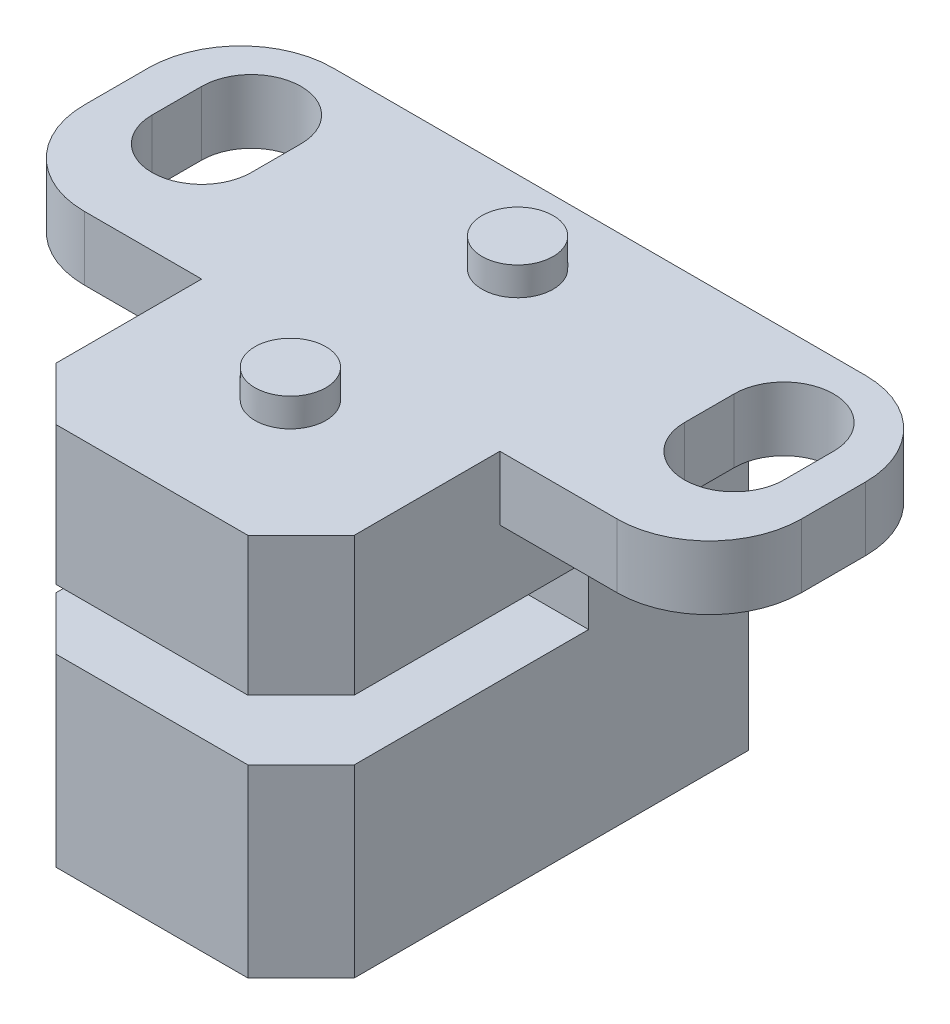
ISO-10303-21;
HEADER;
FILE_DESCRIPTION(('STEP AP214'),'2;1');
FILE_NAME('part.step','',(''),(''),'','','');
FILE_SCHEMA(('AUTOMOTIVE_DESIGN { 1 0 10303 214 1 1 1 1 }'));
ENDSEC;
DATA;
#1=APPLICATION_CONTEXT('core data for automotive mechanical design processes');
#2=APPLICATION_PROTOCOL_DEFINITION('international standard','automotive_design',2000,#1);
#3=PRODUCT_CONTEXT('',#1,'mechanical');
#4=PRODUCT('Part','Part','',(#3));
#5=PRODUCT_RELATED_PRODUCT_CATEGORY('part','',(#4));
#6=PRODUCT_DEFINITION_FORMATION('','',#4);
#7=PRODUCT_DEFINITION_CONTEXT('part definition',#1,'design');
#8=PRODUCT_DEFINITION('design','',#6,#7);
#9=PRODUCT_DEFINITION_SHAPE('','',#8);
#10=(LENGTH_UNIT() NAMED_UNIT(*) SI_UNIT(.MILLI.,.METRE.));
#11=(NAMED_UNIT(*) PLANE_ANGLE_UNIT() SI_UNIT($,.RADIAN.));
#12=(NAMED_UNIT(*) SI_UNIT($,.STERADIAN.) SOLID_ANGLE_UNIT());
#13=UNCERTAINTY_MEASURE_WITH_UNIT(LENGTH_MEASURE(1.E-05),#10,'distance_accuracy_value','');
#14=(GEOMETRIC_REPRESENTATION_CONTEXT(3) GLOBAL_UNCERTAINTY_ASSIGNED_CONTEXT((#13)) GLOBAL_UNIT_ASSIGNED_CONTEXT((#10,
#11,#12)) REPRESENTATION_CONTEXT('',''));
#15=CARTESIAN_POINT('',(0.,0.,0.));
#16=DIRECTION('',(0.,0.,1.));
#17=DIRECTION('',(1.,0.,0.));
#18=AXIS2_PLACEMENT_3D('',#15,#16,#17);
#19=CARTESIAN_POINT('',(-4.2,10.8,4.8));
#20=DIRECTION('',(0.707106781186547,0.,-0.707106781186547));
#21=DIRECTION('',(-0.707106781186548,0.,-0.707106781186547));
#22=AXIS2_PLACEMENT_3D('',#19,#20,#21);
#23=PLANE('',#22);
#24=DIRECTION('',(0.,-1.,0.));
#25=VECTOR('',#24,1.);
#26=CARTESIAN_POINT('',(-4.2,10.8,4.8));
#27=LINE('',#26,#25);
#28=CARTESIAN_POINT('',(-4.2,10.8,4.8));
#29=VERTEX_POINT('',#28);
#30=CARTESIAN_POINT('',(-4.2,6.9,4.8));
#31=VERTEX_POINT('',#30);
#32=EDGE_CURVE('E448',#29,#31,#27,.T.);
#33=ORIENTED_EDGE('',*,*,#32,.T.);
#34=DIRECTION('',(0.707106781186548,0.,0.707106781186547));
#35=VECTOR('',#34,1.);
#36=CARTESIAN_POINT('',(-4.2,6.9,4.8));
#37=LINE('',#36,#35);
#38=CARTESIAN_POINT('',(-2.7,6.9,6.3));
#39=VERTEX_POINT('',#38);
#40=EDGE_CURVE('E258',#31,#39,#37,.T.);
#41=ORIENTED_EDGE('',*,*,#40,.T.);
#42=DIRECTION('',(0.,-1.,0.));
#43=VECTOR('',#42,1.);
#44=CARTESIAN_POINT('',(-2.7,10.8,6.3));
#45=LINE('',#44,#43);
#46=CARTESIAN_POINT('',(-2.7,10.8,6.3));
#47=VERTEX_POINT('',#46);
#48=EDGE_CURVE('E445',#47,#39,#45,.T.);
#49=ORIENTED_EDGE('',*,*,#48,.F.);
#50=DIRECTION('',(0.707106781186548,0.,0.707106781186547));
#51=VECTOR('',#50,1.);
#52=CARTESIAN_POINT('',(-4.2,10.8,4.8));
#53=LINE('',#52,#51);
#54=EDGE_CURVE('E415',#29,#47,#53,.T.);
#55=ORIENTED_EDGE('',*,*,#54,.F.);
#56=EDGE_LOOP('',(#33,#41,#49,#55));
#57=FACE_BOUND('',#56,.T.);
#58=ADVANCED_FACE('F34',(#57),#23,.F.);
#59=CARTESIAN_POINT('',(-2.7,10.8,6.3));
#60=DIRECTION('',(0.,0.,-1.));
#61=DIRECTION('',(-1.,0.,0.));
#62=AXIS2_PLACEMENT_3D('',#59,#60,#61);
#63=PLANE('',#62);
#64=ORIENTED_EDGE('',*,*,#48,.T.);
#65=DIRECTION('',(1.,0.,0.));
#66=VECTOR('',#65,1.);
#67=CARTESIAN_POINT('',(-10.1,6.9,6.3));
#68=LINE('',#67,#66);
#69=CARTESIAN_POINT('',(2.70000000000001,6.9,6.3));
#70=VERTEX_POINT('',#69);
#71=EDGE_CURVE('E532',#39,#70,#68,.T.);
#72=ORIENTED_EDGE('',*,*,#71,.T.);
#73=DIRECTION('',(0.,-1.,0.));
#74=VECTOR('',#73,1.);
#75=CARTESIAN_POINT('',(2.7,10.8,6.3));
#76=LINE('',#75,#74);
#77=CARTESIAN_POINT('',(2.7,10.8,6.3));
#78=VERTEX_POINT('',#77);
#79=EDGE_CURVE('E441',#78,#70,#76,.T.);
#80=ORIENTED_EDGE('',*,*,#79,.F.);
#81=DIRECTION('',(1.,0.,0.));
#82=VECTOR('',#81,1.);
#83=CARTESIAN_POINT('',(-2.7,10.8,6.3));
#84=LINE('',#83,#82);
#85=EDGE_CURVE('E417',#47,#78,#84,.T.);
#86=ORIENTED_EDGE('',*,*,#85,.F.);
#87=EDGE_LOOP('',(#64,#72,#80,#86));
#88=FACE_BOUND('',#87,.T.);
#89=ADVANCED_FACE('F531',(#88),#63,.F.);
#90=CARTESIAN_POINT('',(2.7,10.8,6.3));
#91=DIRECTION('',(-0.707106781186547,0.,-0.707106781186547));
#92=DIRECTION('',(-0.707106781186548,0.,0.707106781186547));
#93=AXIS2_PLACEMENT_3D('',#90,#91,#92);
#94=PLANE('',#93);
#95=ORIENTED_EDGE('',*,*,#79,.T.);
#96=DIRECTION('',(0.707106781186548,0.,-0.707106781186547));
#97=VECTOR('',#96,1.);
#98=CARTESIAN_POINT('',(2.7,6.9,6.3));
#99=LINE('',#98,#97);
#100=CARTESIAN_POINT('',(4.2,6.9,4.8));
#101=VERTEX_POINT('',#100);
#102=EDGE_CURVE('E242',#70,#101,#99,.T.);
#103=ORIENTED_EDGE('',*,*,#102,.T.);
#104=DIRECTION('',(0.,-1.,0.));
#105=VECTOR('',#104,1.);
#106=CARTESIAN_POINT('',(4.2,10.8,4.8));
#107=LINE('',#106,#105);
#108=CARTESIAN_POINT('',(4.2,10.8,4.8));
#109=VERTEX_POINT('',#108);
#110=EDGE_CURVE('E437',#109,#101,#107,.T.);
#111=ORIENTED_EDGE('',*,*,#110,.F.);
#112=DIRECTION('',(0.707106781186548,0.,-0.707106781186547));
#113=VECTOR('',#112,1.);
#114=CARTESIAN_POINT('',(2.7,10.8,6.3));
#115=LINE('',#114,#113);
#116=EDGE_CURVE('E419',#78,#109,#115,.T.);
#117=ORIENTED_EDGE('',*,*,#116,.F.);
#118=EDGE_LOOP('',(#95,#103,#111,#117));
#119=FACE_BOUND('',#118,.T.);
#120=ADVANCED_FACE('F534',(#119),#94,.F.);
#121=CARTESIAN_POINT('',(4.2,10.8,4.8));
#122=DIRECTION('',(-1.,0.,0.));
#123=DIRECTION('',(0.,0.,1.));
#124=AXIS2_PLACEMENT_3D('',#121,#122,#123);
#125=PLANE('',#124);
#126=ORIENTED_EDGE('',*,*,#110,.T.);
#127=DIRECTION('',(0.,0.,-1.));
#128=VECTOR('',#127,1.);
#129=CARTESIAN_POINT('',(4.2,6.9,4.8));
#130=LINE('',#129,#128);
#131=CARTESIAN_POINT('',(4.2,6.9,-1.8));
#132=VERTEX_POINT('',#131);
#133=EDGE_CURVE('E254',#101,#132,#130,.T.);
#134=ORIENTED_EDGE('',*,*,#133,.T.);
#135=DIRECTION('',(0.,-1.,0.));
#136=VECTOR('',#135,1.);
#137=CARTESIAN_POINT('',(4.2,10.8,-1.8));
#138=LINE('',#137,#136);
#139=CARTESIAN_POINT('',(4.2,5.2,-1.8));
#140=VERTEX_POINT('',#139);
#141=EDGE_CURVE('E267',#132,#140,#138,.T.);
#142=ORIENTED_EDGE('',*,*,#141,.T.);
#143=DIRECTION('',(0.,0.,1.));
#144=VECTOR('',#143,1.);
#145=CARTESIAN_POINT('',(4.2,5.2,4.8));
#146=LINE('',#145,#144);
#147=CARTESIAN_POINT('',(4.2,5.2,4.8));
#148=VERTEX_POINT('',#147);
#149=EDGE_CURVE('E248',#140,#148,#146,.T.);
#150=ORIENTED_EDGE('',*,*,#149,.T.);
#151=CARTESIAN_POINT('',(4.2,0.,4.8));
#152=VERTEX_POINT('',#151);
#153=EDGE_CURVE('E421',#148,#152,#107,.T.);
#154=ORIENTED_EDGE('',*,*,#153,.T.);
#155=DIRECTION('',(0.,0.,-1.));
#156=VECTOR('',#155,1.);
#157=CARTESIAN_POINT('',(4.2,0.,4.8));
#158=LINE('',#157,#156);
#159=CARTESIAN_POINT('',(4.2,0.,-6.3));
#160=VERTEX_POINT('',#159);
#161=EDGE_CURVE('E406',#152,#160,#158,.T.);
#162=ORIENTED_EDGE('',*,*,#161,.T.);
#163=DIRECTION('',(0.,-1.,0.));
#164=VECTOR('',#163,1.);
#165=CARTESIAN_POINT('',(4.2,10.8,-6.3));
#166=LINE('',#165,#164);
#167=CARTESIAN_POINT('',(4.2,9.,-6.3));
#168=VERTEX_POINT('',#167);
#169=EDGE_CURVE('E453',#168,#160,#166,.T.);
#170=ORIENTED_EDGE('',*,*,#169,.F.);
#171=DIRECTION('',(0.,0.,1.));
#172=VECTOR('',#171,1.);
#173=CARTESIAN_POINT('',(4.2,9.,4.8));
#174=LINE('',#173,#172);
#175=CARTESIAN_POINT('',(4.2,9.,0.7));
#176=VERTEX_POINT('',#175);
#177=EDGE_CURVE('E403',#168,#176,#174,.T.);
#178=ORIENTED_EDGE('',*,*,#177,.T.);
#179=DIRECTION('',(0.,1.,0.));
#180=VECTOR('',#179,1.);
#181=CARTESIAN_POINT('',(4.2,10.8,0.7));
#182=LINE('',#181,#180);
#183=CARTESIAN_POINT('',(4.2,10.8,0.7));
#184=VERTEX_POINT('',#183);
#185=EDGE_CURVE('E400',#176,#184,#182,.T.);
#186=ORIENTED_EDGE('',*,*,#185,.T.);
#187=DIRECTION('',(0.,0.,-1.));
#188=VECTOR('',#187,1.);
#189=CARTESIAN_POINT('',(4.2,10.8,4.8));
#190=LINE('',#189,#188);
#191=EDGE_CURVE('E407',#109,#184,#190,.T.);
#192=ORIENTED_EDGE('',*,*,#191,.F.);
#193=EDGE_LOOP('',(#126,#134,#142,#150,#154,#162,#170,#178,#186,#192));
#194=FACE_BOUND('',#193,.T.);
#195=ADVANCED_FACE('F36',(#194),#125,.F.);
#196=CARTESIAN_POINT('',(-4.2,10.8,-6.3));
#197=DIRECTION('',(0.,0.,1.));
#198=DIRECTION('',(1.,0.,0.));
#199=AXIS2_PLACEMENT_3D('',#196,#197,#198);
#200=PLANE('',#199);
#201=DIRECTION('',(0.,-1.,0.));
#202=VECTOR('',#201,1.);
#203=CARTESIAN_POINT('',(-4.2,10.8,-6.3));
#204=LINE('',#203,#202);
#205=CARTESIAN_POINT('',(-4.2,9.,-6.3));
#206=VERTEX_POINT('',#205);
#207=CARTESIAN_POINT('',(-4.2,0.,-6.3));
#208=VERTEX_POINT('',#207);
#209=EDGE_CURVE('E451',#206,#208,#204,.T.);
#210=ORIENTED_EDGE('',*,*,#209,.F.);
#211=DIRECTION('',(-1.,0.,0.));
#212=VECTOR('',#211,1.);
#213=CARTESIAN_POINT('',(-7.5,9.,-6.3));
#214=LINE('',#213,#212);
#215=CARTESIAN_POINT('',(-7.5,9.,-6.3));
#216=VERTEX_POINT('',#215);
#217=EDGE_CURVE('E335',#206,#216,#214,.T.);
#218=ORIENTED_EDGE('',*,*,#217,.T.);
#219=DIRECTION('',(0.,1.,0.));
#220=VECTOR('',#219,1.);
#221=CARTESIAN_POINT('',(-7.5,9.,-6.3));
#222=LINE('',#221,#220);
#223=CARTESIAN_POINT('',(-7.5,10.8,-6.3));
#224=VERTEX_POINT('',#223);
#225=EDGE_CURVE('E393',#216,#224,#222,.T.);
#226=ORIENTED_EDGE('',*,*,#225,.T.);
#227=DIRECTION('',(-1.,0.,0.));
#228=VECTOR('',#227,1.);
#229=CARTESIAN_POINT('',(-4.2,10.8,-6.3));
#230=LINE('',#229,#228);
#231=CARTESIAN_POINT('',(7.5,10.8,-6.3));
#232=VERTEX_POINT('',#231);
#233=EDGE_CURVE('E410',#232,#224,#230,.T.);
#234=ORIENTED_EDGE('',*,*,#233,.F.);
#235=DIRECTION('',(0.,1.,0.));
#236=VECTOR('',#235,1.);
#237=CARTESIAN_POINT('',(7.5,9.,-6.3));
#238=LINE('',#237,#236);
#239=CARTESIAN_POINT('',(7.5,9.,-6.3));
#240=VERTEX_POINT('',#239);
#241=EDGE_CURVE('E359',#240,#232,#238,.T.);
#242=ORIENTED_EDGE('',*,*,#241,.F.);
#243=EDGE_CURVE('E337',#240,#168,#214,.T.);
#244=ORIENTED_EDGE('',*,*,#243,.T.);
#245=ORIENTED_EDGE('',*,*,#169,.T.);
#246=DIRECTION('',(-1.,0.,0.));
#247=VECTOR('',#246,1.);
#248=CARTESIAN_POINT('',(-4.2,0.,-6.3));
#249=LINE('',#248,#247);
#250=EDGE_CURVE('E424',#160,#208,#249,.T.);
#251=ORIENTED_EDGE('',*,*,#250,.T.);
#252=EDGE_LOOP('',(#210,#218,#226,#234,#242,#244,#245,#251));
#253=FACE_BOUND('',#252,.T.);
#254=ADVANCED_FACE('F505',(#253),#200,.F.);
#255=CARTESIAN_POINT('',(-4.2,10.8,4.8));
#256=DIRECTION('',(1.,0.,0.));
#257=DIRECTION('',(0.,0.,-1.));
#258=AXIS2_PLACEMENT_3D('',#255,#256,#257);
#259=PLANE('',#258);
#260=DIRECTION('',(0.,1.,0.));
#261=VECTOR('',#260,1.);
#262=CARTESIAN_POINT('',(-4.2,10.8,-1.8));
#263=LINE('',#262,#261);
#264=CARTESIAN_POINT('',(-4.2,5.2,-1.8));
#265=VERTEX_POINT('',#264);
#266=CARTESIAN_POINT('',(-4.2,6.9,-1.8));
#267=VERTEX_POINT('',#266);
#268=EDGE_CURVE('E232',#265,#267,#263,.T.);
#269=ORIENTED_EDGE('',*,*,#268,.T.);
#270=DIRECTION('',(0.,0.,1.));
#271=VECTOR('',#270,1.);
#272=CARTESIAN_POINT('',(-4.2,6.9,4.8));
#273=LINE('',#272,#271);
#274=EDGE_CURVE('E265',#267,#31,#273,.T.);
#275=ORIENTED_EDGE('',*,*,#274,.T.);
#276=ORIENTED_EDGE('',*,*,#32,.F.);
#277=DIRECTION('',(0.,0.,1.));
#278=VECTOR('',#277,1.);
#279=CARTESIAN_POINT('',(-4.2,10.8,4.8));
#280=LINE('',#279,#278);
#281=CARTESIAN_POINT('',(-4.2,10.8,0.7));
#282=VERTEX_POINT('',#281);
#283=EDGE_CURVE('E413',#282,#29,#280,.T.);
#284=ORIENTED_EDGE('',*,*,#283,.F.);
#285=DIRECTION('',(0.,-1.,0.));
#286=VECTOR('',#285,1.);
#287=CARTESIAN_POINT('',(-4.2,10.8,0.7));
#288=LINE('',#287,#286);
#289=CARTESIAN_POINT('',(-4.2,9.,0.7));
#290=VERTEX_POINT('',#289);
#291=EDGE_CURVE('E381',#282,#290,#288,.T.);
#292=ORIENTED_EDGE('',*,*,#291,.T.);
#293=DIRECTION('',(0.,0.,-1.));
#294=VECTOR('',#293,1.);
#295=CARTESIAN_POINT('',(-4.2,9.,4.8));
#296=LINE('',#295,#294);
#297=EDGE_CURVE('E455',#290,#206,#296,.T.);
#298=ORIENTED_EDGE('',*,*,#297,.T.);
#299=ORIENTED_EDGE('',*,*,#209,.T.);
#300=DIRECTION('',(0.,0.,1.));
#301=VECTOR('',#300,1.);
#302=CARTESIAN_POINT('',(-4.2,0.,4.8));
#303=LINE('',#302,#301);
#304=CARTESIAN_POINT('',(-4.2,0.,4.8));
#305=VERTEX_POINT('',#304);
#306=EDGE_CURVE('E427',#208,#305,#303,.T.);
#307=ORIENTED_EDGE('',*,*,#306,.T.);
#308=CARTESIAN_POINT('',(-4.2,5.2,4.8));
#309=VERTEX_POINT('',#308);
#310=EDGE_CURVE('E253',#309,#305,#27,.T.);
#311=ORIENTED_EDGE('',*,*,#310,.F.);
#312=DIRECTION('',(0.,0.,-1.));
#313=VECTOR('',#312,1.);
#314=CARTESIAN_POINT('',(-4.2,5.2,4.8));
#315=LINE('',#314,#313);
#316=EDGE_CURVE('E245',#309,#265,#315,.T.);
#317=ORIENTED_EDGE('',*,*,#316,.T.);
#318=EDGE_LOOP('',(#269,#275,#276,#284,#292,#298,#299,#307,#311,#317));
#319=FACE_BOUND('',#318,.T.);
#320=ADVANCED_FACE('F251',(#319),#259,.F.);
#321=CARTESIAN_POINT('',(-2.7,5.2,6.3));
#322=VERTEX_POINT('',#321);
#323=CARTESIAN_POINT('',(-2.7,0.,6.3));
#324=VERTEX_POINT('',#323);
#325=EDGE_CURVE('E444',#322,#324,#45,.T.);
#326=ORIENTED_EDGE('',*,*,#325,.F.);
#327=DIRECTION('',(-0.707106781186548,0.,-0.707106781186547));
#328=VECTOR('',#327,1.);
#329=CARTESIAN_POINT('',(-4.2,5.2,4.8));
#330=LINE('',#329,#328);
#331=EDGE_CURVE('E255',#322,#309,#330,.T.);
#332=ORIENTED_EDGE('',*,*,#331,.T.);
#333=ORIENTED_EDGE('',*,*,#310,.T.);
#334=DIRECTION('',(0.707106781186548,0.,0.707106781186547));
#335=VECTOR('',#334,1.);
#336=CARTESIAN_POINT('',(-4.2,0.,4.8));
#337=LINE('',#336,#335);
#338=EDGE_CURVE('E429',#305,#324,#337,.T.);
#339=ORIENTED_EDGE('',*,*,#338,.T.);
#340=EDGE_LOOP('',(#326,#332,#333,#339));
#341=FACE_BOUND('',#340,.T.);
#342=ADVANCED_FACE('F565',(#341),#23,.F.);
#343=CARTESIAN_POINT('',(2.7,5.2,6.3));
#344=VERTEX_POINT('',#343);
#345=CARTESIAN_POINT('',(2.7,0.,6.3));
#346=VERTEX_POINT('',#345);
#347=EDGE_CURVE('E440',#344,#346,#76,.T.);
#348=ORIENTED_EDGE('',*,*,#347,.F.);
#349=DIRECTION('',(1.,0.,0.));
#350=VECTOR('',#349,1.);
#351=CARTESIAN_POINT('',(-10.1,5.2,6.3));
#352=LINE('',#351,#350);
#353=EDGE_CURVE('E49',#322,#344,#352,.T.);
#354=ORIENTED_EDGE('',*,*,#353,.F.);
#355=ORIENTED_EDGE('',*,*,#325,.T.);
#356=DIRECTION('',(1.,0.,0.));
#357=VECTOR('',#356,1.);
#358=CARTESIAN_POINT('',(-2.7,0.,6.3));
#359=LINE('',#358,#357);
#360=EDGE_CURVE('E432',#324,#346,#359,.T.);
#361=ORIENTED_EDGE('',*,*,#360,.T.);
#362=EDGE_LOOP('',(#348,#354,#355,#361));
#363=FACE_BOUND('',#362,.T.);
#364=ADVANCED_FACE('F570',(#363),#63,.F.);
#365=ORIENTED_EDGE('',*,*,#153,.F.);
#366=DIRECTION('',(-0.707106781186548,0.,0.707106781186547));
#367=VECTOR('',#366,1.);
#368=CARTESIAN_POINT('',(2.7,5.2,6.3));
#369=LINE('',#368,#367);
#370=EDGE_CURVE('E458',#148,#344,#369,.T.);
#371=ORIENTED_EDGE('',*,*,#370,.T.);
#372=ORIENTED_EDGE('',*,*,#347,.T.);
#373=DIRECTION('',(0.707106781186548,0.,-0.707106781186547));
#374=VECTOR('',#373,1.);
#375=CARTESIAN_POINT('',(2.7,0.,6.3));
#376=LINE('',#375,#374);
#377=EDGE_CURVE('E411',#346,#152,#376,.T.);
#378=ORIENTED_EDGE('',*,*,#377,.T.);
#379=EDGE_LOOP('',(#365,#371,#372,#378));
#380=FACE_BOUND('',#379,.T.);
#381=ADVANCED_FACE('F470',(#380),#94,.F.);
#382=CARTESIAN_POINT('',(0.,10.8,0.));
#383=DIRECTION('',(0.,-1.,0.));
#384=DIRECTION('',(0.,0.,-1.));
#385=AXIS2_PLACEMENT_3D('',#382,#383,#384);
#386=PLANE('',#385);
#387=CARTESIAN_POINT('',(0.,10.8,-4.));
#388=DIRECTION('',(0.,-1.,0.));
#389=DIRECTION('',(0.,0.,-1.));
#390=AXIS2_PLACEMENT_3D('',#387,#388,#389);
#391=CIRCLE('',#390,1.);
#392=CARTESIAN_POINT('',(0.,10.8,-5.));
#393=VERTEX_POINT('',#392);
#394=EDGE_CURVE('E11',#393,#393,#391,.F.);
#395=ORIENTED_EDGE('',*,*,#394,.F.);
#396=EDGE_LOOP('',(#395));
#397=FACE_BOUND('',#396,.T.);
#398=CARTESIAN_POINT('',(0.,10.8,2.4));
#399=DIRECTION('',(0.,-1.,0.));
#400=DIRECTION('',(0.,0.,-1.));
#401=AXIS2_PLACEMENT_3D('',#398,#399,#400);
#402=CIRCLE('',#401,1.);
#403=CARTESIAN_POINT('',(0.,10.8,1.4));
#404=VERTEX_POINT('',#403);
#405=EDGE_CURVE('E42',#404,#404,#402,.F.);
#406=ORIENTED_EDGE('',*,*,#405,.F.);
#407=EDGE_LOOP('',(#406));
#408=FACE_BOUND('',#407,.T.);
#409=DIRECTION('',(0.,0.,-1.));
#410=VECTOR('',#409,1.);
#411=CARTESIAN_POINT('',(-8.9,10.8,-4.));
#412=LINE('',#411,#410);
#413=CARTESIAN_POINT('',(-8.9,10.8,-2.6));
#414=VERTEX_POINT('',#413);
#415=CARTESIAN_POINT('',(-8.9,10.8,-4.));
#416=VERTEX_POINT('',#415);
#417=EDGE_CURVE('E278',#414,#416,#412,.T.);
#418=ORIENTED_EDGE('',*,*,#417,.T.);
#419=CARTESIAN_POINT('',(-7.5,10.8,-4.));
#420=DIRECTION('',(0.,-1.,0.));
#421=DIRECTION('',(0.,0.,1.));
#422=AXIS2_PLACEMENT_3D('',#419,#420,#421);
#423=CIRCLE('',#422,1.4);
#424=CARTESIAN_POINT('',(-6.1,10.8,-4.));
#425=VERTEX_POINT('',#424);
#426=EDGE_CURVE('E270',#416,#425,#423,.T.);
#427=ORIENTED_EDGE('',*,*,#426,.T.);
#428=DIRECTION('',(0.,0.,1.));
#429=VECTOR('',#428,1.);
#430=CARTESIAN_POINT('',(-6.1,10.8,-4.));
#431=LINE('',#430,#429);
#432=CARTESIAN_POINT('',(-6.1,10.8,-2.6));
#433=VERTEX_POINT('',#432);
#434=EDGE_CURVE('E273',#425,#433,#431,.T.);
#435=ORIENTED_EDGE('',*,*,#434,.T.);
#436=CARTESIAN_POINT('',(-7.5,10.8,-2.6));
#437=DIRECTION('',(0.,-1.,0.));
#438=DIRECTION('',(0.,0.,1.));
#439=AXIS2_PLACEMENT_3D('',#436,#437,#438);
#440=CIRCLE('',#439,1.4);
#441=EDGE_CURVE('E57',#433,#414,#440,.T.);
#442=ORIENTED_EDGE('',*,*,#441,.T.);
#443=EDGE_LOOP('',(#418,#427,#435,#442));
#444=FACE_BOUND('',#443,.T.);
#445=DIRECTION('',(0.,0.,-1.));
#446=VECTOR('',#445,1.);
#447=CARTESIAN_POINT('',(6.1,10.8,-4.));
#448=LINE('',#447,#446);
#449=CARTESIAN_POINT('',(6.1,10.8,-2.6));
#450=VERTEX_POINT('',#449);
#451=CARTESIAN_POINT('',(6.1,10.8,-4.));
#452=VERTEX_POINT('',#451);
#453=EDGE_CURVE('E310',#450,#452,#448,.T.);
#454=ORIENTED_EDGE('',*,*,#453,.T.);
#455=CARTESIAN_POINT('',(7.5,10.8,-4.));
#456=DIRECTION('',(0.,-1.,0.));
#457=DIRECTION('',(0.,0.,-1.));
#458=AXIS2_PLACEMENT_3D('',#455,#456,#457);
#459=CIRCLE('',#458,1.4);
#460=CARTESIAN_POINT('',(8.90000000000001,10.8,-4.));
#461=VERTEX_POINT('',#460);
#462=EDGE_CURVE('E300',#452,#461,#459,.T.);
#463=ORIENTED_EDGE('',*,*,#462,.T.);
#464=DIRECTION('',(0.,0.,1.));
#465=VECTOR('',#464,1.);
#466=CARTESIAN_POINT('',(8.90000000000001,10.8,-4.));
#467=LINE('',#466,#465);
#468=CARTESIAN_POINT('',(8.90000000000001,10.8,-2.6));
#469=VERTEX_POINT('',#468);
#470=EDGE_CURVE('E303',#461,#469,#467,.T.);
#471=ORIENTED_EDGE('',*,*,#470,.T.);
#472=CARTESIAN_POINT('',(7.5,10.8,-2.6));
#473=DIRECTION('',(0.,-1.,0.));
#474=DIRECTION('',(0.,0.,-1.));
#475=AXIS2_PLACEMENT_3D('',#472,#473,#474);
#476=CIRCLE('',#475,1.4);
#477=EDGE_CURVE('E307',#469,#450,#476,.T.);
#478=ORIENTED_EDGE('',*,*,#477,.T.);
#479=EDGE_LOOP('',(#454,#463,#471,#478));
#480=FACE_BOUND('',#479,.T.);
#481=ORIENTED_EDGE('',*,*,#191,.T.);
#482=DIRECTION('',(1.,0.,0.));
#483=VECTOR('',#482,1.);
#484=CARTESIAN_POINT('',(-7.5,10.8,0.7));
#485=LINE('',#484,#483);
#486=CARTESIAN_POINT('',(7.5,10.8,0.7));
#487=VERTEX_POINT('',#486);
#488=EDGE_CURVE('E371',#184,#487,#485,.T.);
#489=ORIENTED_EDGE('',*,*,#488,.T.);
#490=CARTESIAN_POINT('',(7.5,10.8,-1.9));
#491=DIRECTION('',(0.,1.,0.));
#492=DIRECTION('',(0.,0.,1.));
#493=AXIS2_PLACEMENT_3D('',#490,#491,#492);
#494=CIRCLE('',#493,2.6);
#495=CARTESIAN_POINT('',(10.1,10.8,-1.9));
#496=VERTEX_POINT('',#495);
#497=EDGE_CURVE('E374',#487,#496,#494,.T.);
#498=ORIENTED_EDGE('',*,*,#497,.T.);
#499=DIRECTION('',(0.,0.,-1.));
#500=VECTOR('',#499,1.);
#501=CARTESIAN_POINT('',(10.1,10.8,-1.9));
#502=LINE('',#501,#500);
#503=CARTESIAN_POINT('',(10.1,10.8,-3.7));
#504=VERTEX_POINT('',#503);
#505=EDGE_CURVE('E336',#496,#504,#502,.T.);
#506=ORIENTED_EDGE('',*,*,#505,.T.);
#507=CARTESIAN_POINT('',(7.5,10.8,-3.7));
#508=DIRECTION('',(0.,1.,0.));
#509=DIRECTION('',(0.,0.,-1.));
#510=AXIS2_PLACEMENT_3D('',#507,#508,#509);
#511=CIRCLE('',#510,2.6);
#512=EDGE_CURVE('E325',#504,#232,#511,.T.);
#513=ORIENTED_EDGE('',*,*,#512,.T.);
#514=ORIENTED_EDGE('',*,*,#233,.T.);
#515=CARTESIAN_POINT('',(-7.5,10.8,-3.7));
#516=DIRECTION('',(0.,1.,0.));
#517=DIRECTION('',(0.,0.,-1.));
#518=AXIS2_PLACEMENT_3D('',#515,#516,#517);
#519=CIRCLE('',#518,2.6);
#520=CARTESIAN_POINT('',(-10.1,10.8,-3.7));
#521=VERTEX_POINT('',#520);
#522=EDGE_CURVE('E362',#224,#521,#519,.T.);
#523=ORIENTED_EDGE('',*,*,#522,.T.);
#524=DIRECTION('',(0.,0.,1.));
#525=VECTOR('',#524,1.);
#526=CARTESIAN_POINT('',(-10.1,10.8,-1.9));
#527=LINE('',#526,#525);
#528=CARTESIAN_POINT('',(-10.1,10.8,-1.9));
#529=VERTEX_POINT('',#528);
#530=EDGE_CURVE('E365',#521,#529,#527,.T.);
#531=ORIENTED_EDGE('',*,*,#530,.T.);
#532=CARTESIAN_POINT('',(-7.5,10.8,-1.9));
#533=DIRECTION('',(0.,1.,0.));
#534=DIRECTION('',(0.,0.,1.));
#535=AXIS2_PLACEMENT_3D('',#532,#533,#534);
#536=CIRCLE('',#535,2.6);
#537=CARTESIAN_POINT('',(-7.5,10.8,0.7));
#538=VERTEX_POINT('',#537);
#539=EDGE_CURVE('E368',#529,#538,#536,.T.);
#540=ORIENTED_EDGE('',*,*,#539,.T.);
#541=EDGE_CURVE('E372',#538,#282,#485,.T.);
#542=ORIENTED_EDGE('',*,*,#541,.T.);
#543=ORIENTED_EDGE('',*,*,#283,.T.);
#544=ORIENTED_EDGE('',*,*,#54,.T.);
#545=ORIENTED_EDGE('',*,*,#85,.T.);
#546=ORIENTED_EDGE('',*,*,#116,.T.);
#547=EDGE_LOOP('',(#481,#489,#498,#506,#513,#514,#523,#531,#540,#542,#543,#544,#545,#546));
#548=FACE_BOUND('',#547,.T.);
#549=ADVANCED_FACE('F466',(#397,#408,#444,#480,#548),#386,.F.);
#550=CARTESIAN_POINT('',(0.,0.,0.));
#551=DIRECTION('',(0.,-1.,0.));
#552=DIRECTION('',(0.,0.,-1.));
#553=AXIS2_PLACEMENT_3D('',#550,#551,#552);
#554=PLANE('',#553);
#555=ORIENTED_EDGE('',*,*,#161,.F.);
#556=ORIENTED_EDGE('',*,*,#377,.F.);
#557=ORIENTED_EDGE('',*,*,#360,.F.);
#558=ORIENTED_EDGE('',*,*,#338,.F.);
#559=ORIENTED_EDGE('',*,*,#306,.F.);
#560=ORIENTED_EDGE('',*,*,#250,.F.);
#561=EDGE_LOOP('',(#555,#556,#557,#558,#559,#560));
#562=FACE_BOUND('',#561,.T.);
#563=ADVANCED_FACE('F469',(#562),#554,.T.);
#564=CARTESIAN_POINT('',(-7.5,9.,-1.9));
#565=DIRECTION('',(0.,1.,0.));
#566=DIRECTION('',(0.,0.,1.));
#567=AXIS2_PLACEMENT_3D('',#564,#565,#566);
#568=CYLINDRICAL_SURFACE('',#567,2.6);
#569=ORIENTED_EDGE('',*,*,#539,.F.);
#570=DIRECTION('',(0.,1.,0.));
#571=VECTOR('',#570,1.);
#572=CARTESIAN_POINT('',(-10.1,9.,-1.9));
#573=LINE('',#572,#571);
#574=CARTESIAN_POINT('',(-10.1,9.,-1.9));
#575=VERTEX_POINT('',#574);
#576=EDGE_CURVE('E389',#575,#529,#573,.T.);
#577=ORIENTED_EDGE('',*,*,#576,.F.);
#578=CARTESIAN_POINT('',(-7.5,9.,-1.9));
#579=DIRECTION('',(0.,1.,0.));
#580=DIRECTION('',(0.,0.,1.));
#581=AXIS2_PLACEMENT_3D('',#578,#579,#580);
#582=CIRCLE('',#581,2.6);
#583=CARTESIAN_POINT('',(-7.5,9.,0.7));
#584=VERTEX_POINT('',#583);
#585=EDGE_CURVE('E346',#575,#584,#582,.T.);
#586=ORIENTED_EDGE('',*,*,#585,.T.);
#587=DIRECTION('',(0.,1.,0.));
#588=VECTOR('',#587,1.);
#589=CARTESIAN_POINT('',(-7.5,9.,0.7));
#590=LINE('',#589,#588);
#591=EDGE_CURVE('E387',#584,#538,#590,.T.);
#592=ORIENTED_EDGE('',*,*,#591,.T.);
#593=EDGE_LOOP('',(#569,#577,#586,#592));
#594=FACE_BOUND('',#593,.T.);
#595=ADVANCED_FACE('F517',(#594),#568,.T.);
#596=CARTESIAN_POINT('',(-10.1,9.,-1.9));
#597=DIRECTION('',(-1.,0.,0.));
#598=DIRECTION('',(0.,0.,1.));
#599=AXIS2_PLACEMENT_3D('',#596,#597,#598);
#600=PLANE('',#599);
#601=ORIENTED_EDGE('',*,*,#530,.F.);
#602=DIRECTION('',(0.,1.,0.));
#603=VECTOR('',#602,1.);
#604=CARTESIAN_POINT('',(-10.1,9.,-3.7));
#605=LINE('',#604,#603);
#606=CARTESIAN_POINT('',(-10.1,9.,-3.7));
#607=VERTEX_POINT('',#606);
#608=EDGE_CURVE('E391',#607,#521,#605,.T.);
#609=ORIENTED_EDGE('',*,*,#608,.F.);
#610=DIRECTION('',(0.,0.,1.));
#611=VECTOR('',#610,1.);
#612=CARTESIAN_POINT('',(-10.1,9.,-1.9));
#613=LINE('',#612,#611);
#614=EDGE_CURVE('E343',#607,#575,#613,.T.);
#615=ORIENTED_EDGE('',*,*,#614,.T.);
#616=ORIENTED_EDGE('',*,*,#576,.T.);
#617=EDGE_LOOP('',(#601,#609,#615,#616));
#618=FACE_BOUND('',#617,.T.);
#619=ADVANCED_FACE('F512',(#618),#600,.T.);
#620=CARTESIAN_POINT('',(-7.5,9.,-3.7));
#621=DIRECTION('',(0.,1.,0.));
#622=DIRECTION('',(0.,0.,1.));
#623=AXIS2_PLACEMENT_3D('',#620,#621,#622);
#624=CYLINDRICAL_SURFACE('',#623,2.6);
#625=ORIENTED_EDGE('',*,*,#522,.F.);
#626=ORIENTED_EDGE('',*,*,#225,.F.);
#627=CARTESIAN_POINT('',(-7.5,9.,-3.7));
#628=DIRECTION('',(0.,1.,0.));
#629=DIRECTION('',(0.,0.,-1.));
#630=AXIS2_PLACEMENT_3D('',#627,#628,#629);
#631=CIRCLE('',#630,2.6);
#632=EDGE_CURVE('E340',#216,#607,#631,.T.);
#633=ORIENTED_EDGE('',*,*,#632,.T.);
#634=ORIENTED_EDGE('',*,*,#608,.T.);
#635=EDGE_LOOP('',(#625,#626,#633,#634));
#636=FACE_BOUND('',#635,.T.);
#637=ADVANCED_FACE('F508',(#636),#624,.T.);
#638=CARTESIAN_POINT('',(7.5,9.,-3.7));
#639=DIRECTION('',(0.,-1.,0.));
#640=DIRECTION('',(0.,0.,-1.));
#641=AXIS2_PLACEMENT_3D('',#638,#639,#640);
#642=PLANE('',#641);
#643=CARTESIAN_POINT('',(-7.5,9.,-4.));
#644=DIRECTION('',(0.,-1.,0.));
#645=DIRECTION('',(0.,0.,1.));
#646=AXIS2_PLACEMENT_3D('',#643,#644,#645);
#647=CIRCLE('',#646,1.4);
#648=CARTESIAN_POINT('',(-8.9,9.,-4.));
#649=VERTEX_POINT('',#648);
#650=CARTESIAN_POINT('',(-6.09999999999999,9.,-4.));
#651=VERTEX_POINT('',#650);
#652=EDGE_CURVE('E269',#649,#651,#647,.T.);
#653=ORIENTED_EDGE('',*,*,#652,.F.);
#654=DIRECTION('',(0.,0.,-1.));
#655=VECTOR('',#654,1.);
#656=CARTESIAN_POINT('',(-8.9,9.,-4.));
#657=LINE('',#656,#655);
#658=CARTESIAN_POINT('',(-8.9,9.,-2.6));
#659=VERTEX_POINT('',#658);
#660=EDGE_CURVE('E274',#659,#649,#657,.T.);
#661=ORIENTED_EDGE('',*,*,#660,.F.);
#662=CARTESIAN_POINT('',(-7.5,9.,-2.6));
#663=DIRECTION('',(0.,-1.,0.));
#664=DIRECTION('',(0.,0.,1.));
#665=AXIS2_PLACEMENT_3D('',#662,#663,#664);
#666=CIRCLE('',#665,1.4);
#667=CARTESIAN_POINT('',(-6.1,9.,-2.6));
#668=VERTEX_POINT('',#667);
#669=EDGE_CURVE('E286',#668,#659,#666,.T.);
#670=ORIENTED_EDGE('',*,*,#669,.F.);
#671=DIRECTION('',(0.,0.,1.));
#672=VECTOR('',#671,1.);
#673=CARTESIAN_POINT('',(-6.1,9.,-4.));
#674=LINE('',#673,#672);
#675=EDGE_CURVE('E283',#651,#668,#674,.T.);
#676=ORIENTED_EDGE('',*,*,#675,.F.);
#677=EDGE_LOOP('',(#653,#661,#670,#676));
#678=FACE_BOUND('',#677,.T.);
#679=ORIENTED_EDGE('',*,*,#297,.F.);
#680=DIRECTION('',(1.,0.,0.));
#681=VECTOR('',#680,1.);
#682=CARTESIAN_POINT('',(-7.5,9.,0.7));
#683=LINE('',#682,#681);
#684=EDGE_CURVE('E350',#584,#290,#683,.T.);
#685=ORIENTED_EDGE('',*,*,#684,.F.);
#686=ORIENTED_EDGE('',*,*,#585,.F.);
#687=ORIENTED_EDGE('',*,*,#614,.F.);
#688=ORIENTED_EDGE('',*,*,#632,.F.);
#689=ORIENTED_EDGE('',*,*,#217,.F.);
#690=EDGE_LOOP('',(#679,#685,#686,#687,#688,#689));
#691=FACE_BOUND('',#690,.T.);
#692=ADVANCED_FACE('F548',(#678,#691),#642,.T.);
#693=CARTESIAN_POINT('',(-7.5,9.,0.7));
#694=DIRECTION('',(0.,0.,1.));
#695=DIRECTION('',(1.,0.,0.));
#696=AXIS2_PLACEMENT_3D('',#693,#694,#695);
#697=PLANE('',#696);
#698=ORIENTED_EDGE('',*,*,#291,.F.);
#699=ORIENTED_EDGE('',*,*,#541,.F.);
#700=ORIENTED_EDGE('',*,*,#591,.F.);
#701=ORIENTED_EDGE('',*,*,#684,.T.);
#702=EDGE_LOOP('',(#698,#699,#700,#701));
#703=FACE_BOUND('',#702,.T.);
#704=ADVANCED_FACE('F521',(#703),#697,.T.);
#705=CARTESIAN_POINT('',(7.5,9.,-4.));
#706=DIRECTION('',(0.,-1.,0.));
#707=DIRECTION('',(0.,0.,-1.));
#708=AXIS2_PLACEMENT_3D('',#705,#706,#707);
#709=CIRCLE('',#708,1.4);
#710=CARTESIAN_POINT('',(6.1,9.,-4.));
#711=VERTEX_POINT('',#710);
#712=CARTESIAN_POINT('',(8.90000000000001,9.,-4.));
#713=VERTEX_POINT('',#712);
#714=EDGE_CURVE('E293',#711,#713,#709,.T.);
#715=ORIENTED_EDGE('',*,*,#714,.F.);
#716=DIRECTION('',(0.,0.,-1.));
#717=VECTOR('',#716,1.);
#718=CARTESIAN_POINT('',(6.1,9.,-4.));
#719=LINE('',#718,#717);
#720=CARTESIAN_POINT('',(6.1,9.,-2.6));
#721=VERTEX_POINT('',#720);
#722=EDGE_CURVE('E304',#721,#711,#719,.T.);
#723=ORIENTED_EDGE('',*,*,#722,.F.);
#724=CARTESIAN_POINT('',(7.5,9.,-2.6));
#725=DIRECTION('',(0.,-1.,0.));
#726=DIRECTION('',(0.,0.,-1.));
#727=AXIS2_PLACEMENT_3D('',#724,#725,#726);
#728=CIRCLE('',#727,1.4);
#729=CARTESIAN_POINT('',(8.90000000000001,9.,-2.6));
#730=VERTEX_POINT('',#729);
#731=EDGE_CURVE('E318',#730,#721,#728,.T.);
#732=ORIENTED_EDGE('',*,*,#731,.F.);
#733=DIRECTION('',(0.,0.,1.));
#734=VECTOR('',#733,1.);
#735=CARTESIAN_POINT('',(8.90000000000001,9.,-4.));
#736=LINE('',#735,#734);
#737=EDGE_CURVE('E315',#713,#730,#736,.T.);
#738=ORIENTED_EDGE('',*,*,#737,.F.);
#739=EDGE_LOOP('',(#715,#723,#732,#738));
#740=FACE_BOUND('',#739,.T.);
#741=ORIENTED_EDGE('',*,*,#177,.F.);
#742=ORIENTED_EDGE('',*,*,#243,.F.);
#743=CARTESIAN_POINT('',(7.5,9.,-3.7));
#744=DIRECTION('',(0.,1.,0.));
#745=DIRECTION('',(0.,0.,-1.));
#746=AXIS2_PLACEMENT_3D('',#743,#744,#745);
#747=CIRCLE('',#746,2.6);
#748=CARTESIAN_POINT('',(10.1,9.,-3.7));
#749=VERTEX_POINT('',#748);
#750=EDGE_CURVE('E332',#749,#240,#747,.T.);
#751=ORIENTED_EDGE('',*,*,#750,.F.);
#752=DIRECTION('',(0.,0.,-1.));
#753=VECTOR('',#752,1.);
#754=CARTESIAN_POINT('',(10.1,9.,-1.9));
#755=LINE('',#754,#753);
#756=CARTESIAN_POINT('',(10.1,9.,-1.9));
#757=VERTEX_POINT('',#756);
#758=EDGE_CURVE('E356',#757,#749,#755,.T.);
#759=ORIENTED_EDGE('',*,*,#758,.F.);
#760=CARTESIAN_POINT('',(7.5,9.,-1.9));
#761=DIRECTION('',(0.,1.,0.));
#762=DIRECTION('',(0.,0.,1.));
#763=AXIS2_PLACEMENT_3D('',#760,#761,#762);
#764=CIRCLE('',#763,2.6);
#765=CARTESIAN_POINT('',(7.5,9.,0.7));
#766=VERTEX_POINT('',#765);
#767=EDGE_CURVE('E353',#766,#757,#764,.T.);
#768=ORIENTED_EDGE('',*,*,#767,.F.);
#769=EDGE_CURVE('E349',#176,#766,#683,.T.);
#770=ORIENTED_EDGE('',*,*,#769,.F.);
#771=EDGE_LOOP('',(#741,#742,#751,#759,#768,#770));
#772=FACE_BOUND('',#771,.T.);
#773=ADVANCED_FACE('F488',(#740,#772),#642,.T.);
#774=ORIENTED_EDGE('',*,*,#185,.F.);
#775=ORIENTED_EDGE('',*,*,#769,.T.);
#776=DIRECTION('',(0.,1.,0.));
#777=VECTOR('',#776,1.);
#778=CARTESIAN_POINT('',(7.5,9.,0.7));
#779=LINE('',#778,#777);
#780=EDGE_CURVE('E384',#766,#487,#779,.T.);
#781=ORIENTED_EDGE('',*,*,#780,.T.);
#782=ORIENTED_EDGE('',*,*,#488,.F.);
#783=EDGE_LOOP('',(#774,#775,#781,#782));
#784=FACE_BOUND('',#783,.T.);
#785=ADVANCED_FACE('F484',(#784),#697,.T.);
#786=CARTESIAN_POINT('',(7.5,9.,-3.7));
#787=DIRECTION('',(0.,1.,0.));
#788=DIRECTION('',(0.,0.,1.));
#789=AXIS2_PLACEMENT_3D('',#786,#787,#788);
#790=CYLINDRICAL_SURFACE('',#789,2.6);
#791=ORIENTED_EDGE('',*,*,#512,.F.);
#792=DIRECTION('',(0.,1.,0.));
#793=VECTOR('',#792,1.);
#794=CARTESIAN_POINT('',(10.1,9.,-3.7));
#795=LINE('',#794,#793);
#796=EDGE_CURVE('E379',#749,#504,#795,.T.);
#797=ORIENTED_EDGE('',*,*,#796,.F.);
#798=ORIENTED_EDGE('',*,*,#750,.T.);
#799=ORIENTED_EDGE('',*,*,#241,.T.);
#800=EDGE_LOOP('',(#791,#797,#798,#799));
#801=FACE_BOUND('',#800,.T.);
#802=ADVANCED_FACE('F500',(#801),#790,.T.);
#803=CARTESIAN_POINT('',(10.1,9.,-1.9));
#804=DIRECTION('',(1.,0.,0.));
#805=DIRECTION('',(0.,0.,-1.));
#806=AXIS2_PLACEMENT_3D('',#803,#804,#805);
#807=PLANE('',#806);
#808=ORIENTED_EDGE('',*,*,#505,.F.);
#809=DIRECTION('',(0.,1.,0.));
#810=VECTOR('',#809,1.);
#811=CARTESIAN_POINT('',(10.1,9.,-1.9));
#812=LINE('',#811,#810);
#813=EDGE_CURVE('E382',#757,#496,#812,.T.);
#814=ORIENTED_EDGE('',*,*,#813,.F.);
#815=ORIENTED_EDGE('',*,*,#758,.T.);
#816=ORIENTED_EDGE('',*,*,#796,.T.);
#817=EDGE_LOOP('',(#808,#814,#815,#816));
#818=FACE_BOUND('',#817,.T.);
#819=ADVANCED_FACE('F497',(#818),#807,.T.);
#820=CARTESIAN_POINT('',(7.5,9.,-1.9));
#821=DIRECTION('',(0.,1.,0.));
#822=DIRECTION('',(0.,0.,1.));
#823=AXIS2_PLACEMENT_3D('',#820,#821,#822);
#824=CYLINDRICAL_SURFACE('',#823,2.6);
#825=ORIENTED_EDGE('',*,*,#497,.F.);
#826=ORIENTED_EDGE('',*,*,#780,.F.);
#827=ORIENTED_EDGE('',*,*,#767,.T.);
#828=ORIENTED_EDGE('',*,*,#813,.T.);
#829=EDGE_LOOP('',(#825,#826,#827,#828));
#830=FACE_BOUND('',#829,.T.);
#831=ADVANCED_FACE('F494',(#830),#824,.T.);
#832=CARTESIAN_POINT('',(7.5,10.8,-4.));
#833=DIRECTION('',(0.,-1.,0.));
#834=DIRECTION('',(0.,0.,-1.));
#835=AXIS2_PLACEMENT_3D('',#832,#833,#834);
#836=CYLINDRICAL_SURFACE('',#835,1.4);
#837=ORIENTED_EDGE('',*,*,#714,.T.);
#838=DIRECTION('',(0.,-1.,0.));
#839=VECTOR('',#838,1.);
#840=CARTESIAN_POINT('',(8.90000000000001,10.8,-4.));
#841=LINE('',#840,#839);
#842=EDGE_CURVE('E313',#461,#713,#841,.T.);
#843=ORIENTED_EDGE('',*,*,#842,.F.);
#844=ORIENTED_EDGE('',*,*,#462,.F.);
#845=DIRECTION('',(0.,-1.,0.));
#846=VECTOR('',#845,1.);
#847=CARTESIAN_POINT('',(6.1,10.8,-4.));
#848=LINE('',#847,#846);
#849=EDGE_CURVE('E323',#452,#711,#848,.T.);
#850=ORIENTED_EDGE('',*,*,#849,.T.);
#851=EDGE_LOOP('',(#837,#843,#844,#850));
#852=FACE_BOUND('',#851,.T.);
#853=ADVANCED_FACE('F636',(#852),#836,.F.);
#854=CARTESIAN_POINT('',(6.1,10.8,-4.));
#855=DIRECTION('',(-1.,0.,0.));
#856=DIRECTION('',(0.,0.,1.));
#857=AXIS2_PLACEMENT_3D('',#854,#855,#856);
#858=PLANE('',#857);
#859=ORIENTED_EDGE('',*,*,#722,.T.);
#860=ORIENTED_EDGE('',*,*,#849,.F.);
#861=ORIENTED_EDGE('',*,*,#453,.F.);
#862=DIRECTION('',(0.,-1.,0.));
#863=VECTOR('',#862,1.);
#864=CARTESIAN_POINT('',(6.1,10.8,-2.6));
#865=LINE('',#864,#863);
#866=EDGE_CURVE('E326',#450,#721,#865,.T.);
#867=ORIENTED_EDGE('',*,*,#866,.T.);
#868=EDGE_LOOP('',(#859,#860,#861,#867));
#869=FACE_BOUND('',#868,.T.);
#870=ADVANCED_FACE('F632',(#869),#858,.F.);
#871=CARTESIAN_POINT('',(7.5,10.8,-2.6));
#872=DIRECTION('',(0.,-1.,0.));
#873=DIRECTION('',(0.,0.,-1.));
#874=AXIS2_PLACEMENT_3D('',#871,#872,#873);
#875=CYLINDRICAL_SURFACE('',#874,1.4);
#876=ORIENTED_EDGE('',*,*,#731,.T.);
#877=ORIENTED_EDGE('',*,*,#866,.F.);
#878=ORIENTED_EDGE('',*,*,#477,.F.);
#879=DIRECTION('',(0.,-1.,0.));
#880=VECTOR('',#879,1.);
#881=CARTESIAN_POINT('',(8.90000000000001,10.8,-2.6));
#882=LINE('',#881,#880);
#883=EDGE_CURVE('E328',#469,#730,#882,.T.);
#884=ORIENTED_EDGE('',*,*,#883,.T.);
#885=EDGE_LOOP('',(#876,#877,#878,#884));
#886=FACE_BOUND('',#885,.T.);
#887=ADVANCED_FACE('F635',(#886),#875,.F.);
#888=CARTESIAN_POINT('',(8.90000000000001,10.8,-4.));
#889=DIRECTION('',(1.,0.,0.));
#890=DIRECTION('',(0.,0.,-1.));
#891=AXIS2_PLACEMENT_3D('',#888,#889,#890);
#892=PLANE('',#891);
#893=ORIENTED_EDGE('',*,*,#737,.T.);
#894=ORIENTED_EDGE('',*,*,#883,.F.);
#895=ORIENTED_EDGE('',*,*,#470,.F.);
#896=ORIENTED_EDGE('',*,*,#842,.T.);
#897=EDGE_LOOP('',(#893,#894,#895,#896));
#898=FACE_BOUND('',#897,.T.);
#899=ADVANCED_FACE('F630',(#898),#892,.F.);
#900=CARTESIAN_POINT('',(-7.5,10.8,-4.));
#901=DIRECTION('',(0.,-1.,0.));
#902=DIRECTION('',(0.,0.,-1.));
#903=AXIS2_PLACEMENT_3D('',#900,#901,#902);
#904=CYLINDRICAL_SURFACE('',#903,1.4);
#905=ORIENTED_EDGE('',*,*,#652,.T.);
#906=DIRECTION('',(0.,-1.,0.));
#907=VECTOR('',#906,1.);
#908=CARTESIAN_POINT('',(-6.1,10.8,-4.));
#909=LINE('',#908,#907);
#910=EDGE_CURVE('E281',#425,#651,#909,.T.);
#911=ORIENTED_EDGE('',*,*,#910,.F.);
#912=ORIENTED_EDGE('',*,*,#426,.F.);
#913=DIRECTION('',(0.,-1.,0.));
#914=VECTOR('',#913,1.);
#915=CARTESIAN_POINT('',(-8.9,10.8,-4.));
#916=LINE('',#915,#914);
#917=EDGE_CURVE('E291',#416,#649,#916,.T.);
#918=ORIENTED_EDGE('',*,*,#917,.T.);
#919=EDGE_LOOP('',(#905,#911,#912,#918));
#920=FACE_BOUND('',#919,.T.);
#921=ADVANCED_FACE('F621',(#920),#904,.F.);
#922=CARTESIAN_POINT('',(-8.9,10.8,-4.));
#923=DIRECTION('',(-1.,0.,0.));
#924=DIRECTION('',(0.,0.,1.));
#925=AXIS2_PLACEMENT_3D('',#922,#923,#924);
#926=PLANE('',#925);
#927=ORIENTED_EDGE('',*,*,#660,.T.);
#928=ORIENTED_EDGE('',*,*,#917,.F.);
#929=ORIENTED_EDGE('',*,*,#417,.F.);
#930=DIRECTION('',(0.,-1.,0.));
#931=VECTOR('',#930,1.);
#932=CARTESIAN_POINT('',(-8.9,10.8,-2.6));
#933=LINE('',#932,#931);
#934=EDGE_CURVE('E294',#414,#659,#933,.T.);
#935=ORIENTED_EDGE('',*,*,#934,.T.);
#936=EDGE_LOOP('',(#927,#928,#929,#935));
#937=FACE_BOUND('',#936,.T.);
#938=ADVANCED_FACE('F617',(#937),#926,.F.);
#939=CARTESIAN_POINT('',(-7.5,10.8,-2.6));
#940=DIRECTION('',(0.,-1.,0.));
#941=DIRECTION('',(0.,0.,-1.));
#942=AXIS2_PLACEMENT_3D('',#939,#940,#941);
#943=CYLINDRICAL_SURFACE('',#942,1.4);
#944=ORIENTED_EDGE('',*,*,#669,.T.);
#945=ORIENTED_EDGE('',*,*,#934,.F.);
#946=ORIENTED_EDGE('',*,*,#441,.F.);
#947=DIRECTION('',(0.,-1.,0.));
#948=VECTOR('',#947,1.);
#949=CARTESIAN_POINT('',(-6.1,10.8,-2.6));
#950=LINE('',#949,#948);
#951=EDGE_CURVE('E296',#433,#668,#950,.T.);
#952=ORIENTED_EDGE('',*,*,#951,.T.);
#953=EDGE_LOOP('',(#944,#945,#946,#952));
#954=FACE_BOUND('',#953,.T.);
#955=ADVANCED_FACE('F620',(#954),#943,.F.);
#956=CARTESIAN_POINT('',(-6.1,10.8,-4.));
#957=DIRECTION('',(1.,0.,0.));
#958=DIRECTION('',(0.,0.,-1.));
#959=AXIS2_PLACEMENT_3D('',#956,#957,#958);
#960=PLANE('',#959);
#961=ORIENTED_EDGE('',*,*,#675,.T.);
#962=ORIENTED_EDGE('',*,*,#951,.F.);
#963=ORIENTED_EDGE('',*,*,#434,.F.);
#964=ORIENTED_EDGE('',*,*,#910,.T.);
#965=EDGE_LOOP('',(#961,#962,#963,#964));
#966=FACE_BOUND('',#965,.T.);
#967=ADVANCED_FACE('F614',(#966),#960,.F.);
#968=CARTESIAN_POINT('',(-10.1,5.2,-1.8));
#969=DIRECTION('',(0.,0.,-1.));
#970=DIRECTION('',(-1.,0.,0.));
#971=AXIS2_PLACEMENT_3D('',#968,#969,#970);
#972=PLANE('',#971);
#973=DIRECTION('',(1.,0.,0.));
#974=VECTOR('',#973,1.);
#975=CARTESIAN_POINT('',(-10.1,6.9,-1.8));
#976=LINE('',#975,#974);
#977=EDGE_CURVE('E238',#267,#132,#976,.T.);
#978=ORIENTED_EDGE('',*,*,#977,.F.);
#979=ORIENTED_EDGE('',*,*,#268,.F.);
#980=DIRECTION('',(1.,0.,0.));
#981=VECTOR('',#980,1.);
#982=CARTESIAN_POINT('',(-10.1,5.2,-1.8));
#983=LINE('',#982,#981);
#984=EDGE_CURVE('E235',#265,#140,#983,.T.);
#985=ORIENTED_EDGE('',*,*,#984,.T.);
#986=ORIENTED_EDGE('',*,*,#141,.F.);
#987=EDGE_LOOP('',(#978,#979,#985,#986));
#988=FACE_BOUND('',#987,.T.);
#989=ADVANCED_FACE('F234',(#988),#972,.F.);
#990=CARTESIAN_POINT('',(-10.1,6.9,-1.8));
#991=DIRECTION('',(0.,1.,0.));
#992=DIRECTION('',(0.,0.,1.));
#993=AXIS2_PLACEMENT_3D('',#990,#991,#992);
#994=PLANE('',#993);
#995=ORIENTED_EDGE('',*,*,#977,.T.);
#996=ORIENTED_EDGE('',*,*,#133,.F.);
#997=ORIENTED_EDGE('',*,*,#102,.F.);
#998=ORIENTED_EDGE('',*,*,#71,.F.);
#999=ORIENTED_EDGE('',*,*,#40,.F.);
#1000=ORIENTED_EDGE('',*,*,#274,.F.);
#1001=EDGE_LOOP('',(#995,#996,#997,#998,#999,#1000));
#1002=FACE_BOUND('',#1001,.T.);
#1003=ADVANCED_FACE('F536',(#1002),#994,.F.);
#1004=CARTESIAN_POINT('',(-10.1,5.2,-1.8));
#1005=DIRECTION('',(0.,-1.,0.));
#1006=DIRECTION('',(0.,0.,-1.));
#1007=AXIS2_PLACEMENT_3D('',#1004,#1005,#1006);
#1008=PLANE('',#1007);
#1009=ORIENTED_EDGE('',*,*,#331,.F.);
#1010=ORIENTED_EDGE('',*,*,#353,.T.);
#1011=ORIENTED_EDGE('',*,*,#370,.F.);
#1012=ORIENTED_EDGE('',*,*,#149,.F.);
#1013=ORIENTED_EDGE('',*,*,#984,.F.);
#1014=ORIENTED_EDGE('',*,*,#316,.F.);
#1015=EDGE_LOOP('',(#1009,#1010,#1011,#1012,#1013,#1014));
#1016=FACE_BOUND('',#1015,.T.);
#1017=ADVANCED_FACE('F244',(#1016),#1008,.F.);
#1018=CARTESIAN_POINT('',(0.,11.6,2.4));
#1019=DIRECTION('',(0.,-1.,0.));
#1020=DIRECTION('',(0.,0.,-1.));
#1021=AXIS2_PLACEMENT_3D('',#1018,#1019,#1020);
#1022=CYLINDRICAL_SURFACE('',#1021,1.);
#1023=CARTESIAN_POINT('',(0.,11.6,2.4));
#1024=DIRECTION('',(0.,1.,0.));
#1025=DIRECTION('',(0.,0.,1.));
#1026=AXIS2_PLACEMENT_3D('',#1023,#1024,#1025);
#1027=CIRCLE('',#1026,1.);
#1028=CARTESIAN_POINT('',(0.,11.6,3.4));
#1029=VERTEX_POINT('',#1028);
#1030=EDGE_CURVE('E580',#1029,#1029,#1027,.T.);
#1031=ORIENTED_EDGE('',*,*,#1030,.F.);
#1032=EDGE_LOOP('',(#1031));
#1033=FACE_BOUND('',#1032,.T.);
#1034=ORIENTED_EDGE('',*,*,#405,.T.);
#1035=EDGE_LOOP('',(#1034));
#1036=FACE_BOUND('',#1035,.T.);
#1037=ADVANCED_FACE('F464',(#1033,#1036),#1022,.T.);
#1038=CARTESIAN_POINT('',(0.,11.6,2.4));
#1039=DIRECTION('',(0.,1.,0.));
#1040=DIRECTION('',(0.,0.,1.));
#1041=AXIS2_PLACEMENT_3D('',#1038,#1039,#1040);
#1042=PLANE('',#1041);
#1043=ORIENTED_EDGE('',*,*,#1030,.T.);
#1044=EDGE_LOOP('',(#1043));
#1045=FACE_BOUND('',#1044,.T.);
#1046=ADVANCED_FACE('F596',(#1045),#1042,.T.);
#1047=CARTESIAN_POINT('',(0.,11.6,-4.));
#1048=DIRECTION('',(0.,-1.,0.));
#1049=DIRECTION('',(0.,0.,-1.));
#1050=AXIS2_PLACEMENT_3D('',#1047,#1048,#1049);
#1051=CYLINDRICAL_SURFACE('',#1050,1.);
#1052=CARTESIAN_POINT('',(0.,11.6,-4.));
#1053=DIRECTION('',(0.,1.,0.));
#1054=DIRECTION('',(0.,0.,1.));
#1055=AXIS2_PLACEMENT_3D('',#1052,#1053,#1054);
#1056=CIRCLE('',#1055,1.);
#1057=CARTESIAN_POINT('',(0.,11.6,-3.));
#1058=VERTEX_POINT('',#1057);
#1059=EDGE_CURVE('E583',#1058,#1058,#1056,.T.);
#1060=ORIENTED_EDGE('',*,*,#1059,.F.);
#1061=EDGE_LOOP('',(#1060));
#1062=FACE_BOUND('',#1061,.T.);
#1063=ORIENTED_EDGE('',*,*,#394,.T.);
#1064=EDGE_LOOP('',(#1063));
#1065=FACE_BOUND('',#1064,.T.);
#1066=ADVANCED_FACE('F593',(#1062,#1065),#1051,.T.);
#1067=CARTESIAN_POINT('',(0.,11.6,-4.));
#1068=DIRECTION('',(0.,1.,0.));
#1069=DIRECTION('',(0.,0.,1.));
#1070=AXIS2_PLACEMENT_3D('',#1067,#1068,#1069);
#1071=PLANE('',#1070);
#1072=ORIENTED_EDGE('',*,*,#1059,.T.);
#1073=EDGE_LOOP('',(#1072));
#1074=FACE_BOUND('',#1073,.T.);
#1075=ADVANCED_FACE('F591',(#1074),#1071,.T.);
#1076=CLOSED_SHELL('',(#58,#89,#120,#195,#254,#320,#342,#364,#381,#549,#563,#595,#619,#637,#692,
#704,#773,#785,#802,#819,#831,#853,#870,#887,#899,#921,#938,#955,#967,#989,#1003,#1017,#1037,
#1046,#1066,#1075));
#1077=MANIFOLD_SOLID_BREP('B2',#1076);
#1078=ADVANCED_BREP_SHAPE_REPRESENTATION('',(#18,#1077),#14);
#1079=SHAPE_DEFINITION_REPRESENTATION(#9,#1078);
ENDSEC;
END-ISO-10303-21;
